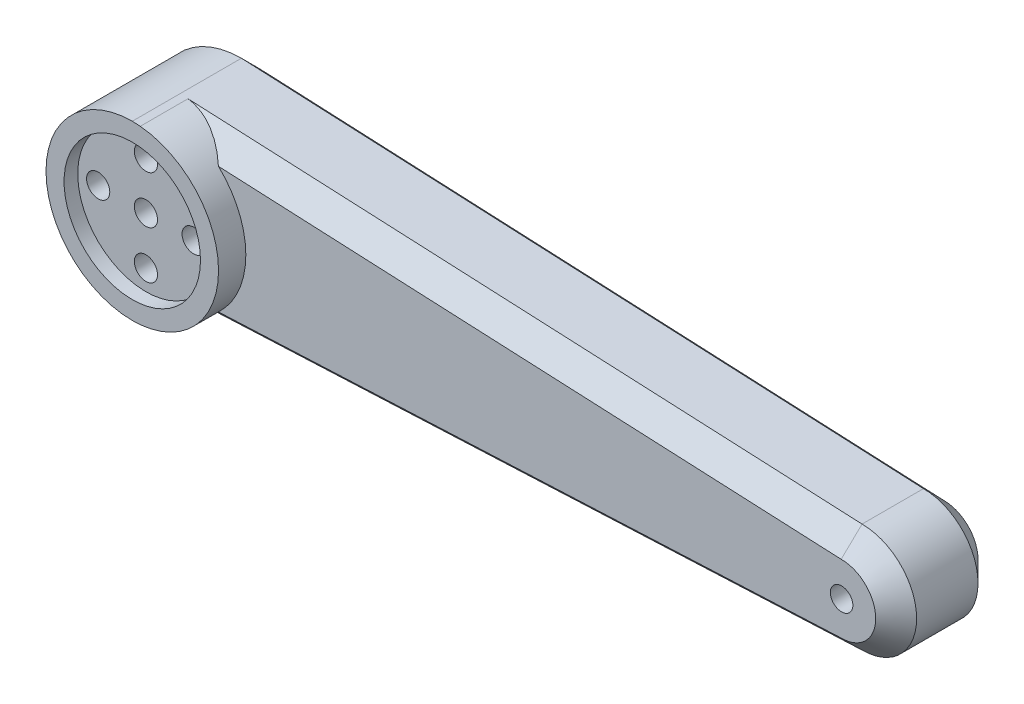
ISO-10303-21;
HEADER;
FILE_DESCRIPTION(('STEP AP214'),'2;1');
FILE_NAME('part.step','',(''),(''),'','','');
FILE_SCHEMA(('AUTOMOTIVE_DESIGN { 1 0 10303 214 1 1 1 1 }'));
ENDSEC;
DATA;
#1=APPLICATION_CONTEXT('core data for automotive mechanical design processes');
#2=APPLICATION_PROTOCOL_DEFINITION('international standard','automotive_design',2000,#1);
#3=PRODUCT_CONTEXT('',#1,'mechanical');
#4=PRODUCT('Part','Part','',(#3));
#5=PRODUCT_RELATED_PRODUCT_CATEGORY('part','',(#4));
#6=PRODUCT_DEFINITION_FORMATION('','',#4);
#7=PRODUCT_DEFINITION_CONTEXT('part definition',#1,'design');
#8=PRODUCT_DEFINITION('design','',#6,#7);
#9=PRODUCT_DEFINITION_SHAPE('','',#8);
#10=(LENGTH_UNIT() NAMED_UNIT(*) SI_UNIT(.MILLI.,.METRE.));
#11=(NAMED_UNIT(*) PLANE_ANGLE_UNIT() SI_UNIT($,.RADIAN.));
#12=(NAMED_UNIT(*) SI_UNIT($,.STERADIAN.) SOLID_ANGLE_UNIT());
#13=UNCERTAINTY_MEASURE_WITH_UNIT(LENGTH_MEASURE(1.E-05),#10,'distance_accuracy_value','');
#14=(GEOMETRIC_REPRESENTATION_CONTEXT(3) GLOBAL_UNCERTAINTY_ASSIGNED_CONTEXT((#13)) GLOBAL_UNIT_ASSIGNED_CONTEXT((#10,
#11,#12)) REPRESENTATION_CONTEXT('',''));
#15=CARTESIAN_POINT('',(0.,0.,0.));
#16=DIRECTION('',(0.,0.,1.));
#17=DIRECTION('',(1.,0.,0.));
#18=AXIS2_PLACEMENT_3D('',#15,#16,#17);
#19=CARTESIAN_POINT('',(100.,0.,17.));
#20=DIRECTION('',(0.,0.,-1.));
#21=DIRECTION('',(-1.,0.,0.));
#22=AXIS2_PLACEMENT_3D('',#19,#20,#21);
#23=CYLINDRICAL_SURFACE('',#22,8.);
#24=DIRECTION('',(0.,0.,-1.));
#25=VECTOR('',#24,1.);
#26=CARTESIAN_POINT('',(100.,8.,17.));
#27=LINE('',#26,#25);
#28=CARTESIAN_POINT('',(100.,8.,12.));
#29=VERTEX_POINT('',#28);
#30=CARTESIAN_POINT('',(100.,8.,3.));
#31=VERTEX_POINT('',#30);
#32=EDGE_CURVE('E229',#29,#31,#27,.T.);
#33=ORIENTED_EDGE('',*,*,#32,.F.);
#34=CARTESIAN_POINT('',(100.,0.,12.));
#35=DIRECTION('',(0.,0.,1.));
#36=DIRECTION('',(1.,0.,0.));
#37=AXIS2_PLACEMENT_3D('',#34,#35,#36);
#38=CIRCLE('',#37,8.);
#39=CARTESIAN_POINT('',(100.,-8.,12.));
#40=VERTEX_POINT('',#39);
#41=EDGE_CURVE('E373',#29,#40,#38,.F.);
#42=ORIENTED_EDGE('',*,*,#41,.T.);
#43=DIRECTION('',(0.,0.,-1.));
#44=VECTOR('',#43,1.);
#45=CARTESIAN_POINT('',(100.,-8.,17.));
#46=LINE('',#45,#44);
#47=CARTESIAN_POINT('',(100.,-8.,3.));
#48=VERTEX_POINT('',#47);
#49=EDGE_CURVE('E231',#40,#48,#46,.T.);
#50=ORIENTED_EDGE('',*,*,#49,.T.);
#51=CARTESIAN_POINT('',(100.,0.,3.));
#52=DIRECTION('',(0.,0.,1.));
#53=DIRECTION('',(1.,0.,0.));
#54=AXIS2_PLACEMENT_3D('',#51,#52,#53);
#55=CIRCLE('',#54,8.);
#56=EDGE_CURVE('E235',#48,#31,#55,.T.);
#57=ORIENTED_EDGE('',*,*,#56,.T.);
#58=EDGE_LOOP('',(#33,#42,#50,#57));
#59=FACE_BOUND('',#58,.T.);
#60=ADVANCED_FACE('F42',(#59),#23,.T.);
#61=CARTESIAN_POINT('',(100.,0.,0.));
#62=DIRECTION('',(0.,0.,1.));
#63=DIRECTION('',(1.,0.,0.));
#64=AXIS2_PLACEMENT_3D('',#61,#62,#63);
#65=CYLINDRICAL_SURFACE('',#64,1.65);
#66=CARTESIAN_POINT('',(100.,0.,0.));
#67=DIRECTION('',(0.,0.,1.));
#68=DIRECTION('',(1.,0.,0.));
#69=AXIS2_PLACEMENT_3D('',#66,#67,#68);
#70=CIRCLE('',#69,1.65);
#71=CARTESIAN_POINT('',(101.65,0.,0.));
#72=VERTEX_POINT('',#71);
#73=EDGE_CURVE('E207',#72,#72,#70,.T.);
#74=ORIENTED_EDGE('',*,*,#73,.F.);
#75=EDGE_LOOP('',(#74));
#76=FACE_BOUND('',#75,.T.);
#77=CARTESIAN_POINT('',(100.,0.,15.));
#78=DIRECTION('',(0.,0.,1.));
#79=DIRECTION('',(1.,0.,0.));
#80=AXIS2_PLACEMENT_3D('',#77,#78,#79);
#81=CIRCLE('',#80,1.65);
#82=CARTESIAN_POINT('',(101.65,0.,15.));
#83=VERTEX_POINT('',#82);
#84=EDGE_CURVE('E173',#83,#83,#81,.F.);
#85=ORIENTED_EDGE('',*,*,#84,.F.);
#86=EDGE_LOOP('',(#85));
#87=FACE_BOUND('',#86,.T.);
#88=ADVANCED_FACE('F407',(#76,#87),#65,.F.);
#89=CARTESIAN_POINT('',(0.,0.,0.));
#90=DIRECTION('',(0.,0.,1.));
#91=DIRECTION('',(1.,0.,0.));
#92=AXIS2_PLACEMENT_3D('',#89,#90,#91);
#93=CYLINDRICAL_SURFACE('',#92,1.7);
#94=CARTESIAN_POINT('',(0.,0.,17.));
#95=DIRECTION('',(0.,0.,1.));
#96=DIRECTION('',(1.,0.,0.));
#97=AXIS2_PLACEMENT_3D('',#94,#95,#96);
#98=CIRCLE('',#97,1.7);
#99=CARTESIAN_POINT('',(1.7,0.,17.));
#100=VERTEX_POINT('',#99);
#101=EDGE_CURVE('E221',#100,#100,#98,.T.);
#102=ORIENTED_EDGE('',*,*,#101,.T.);
#103=EDGE_LOOP('',(#102));
#104=FACE_BOUND('',#103,.T.);
#105=CARTESIAN_POINT('',(0.,0.,2.));
#106=DIRECTION('',(0.,0.,-1.));
#107=DIRECTION('',(-1.,0.,0.));
#108=AXIS2_PLACEMENT_3D('',#105,#106,#107);
#109=CIRCLE('',#108,1.7);
#110=CARTESIAN_POINT('',(-1.7,0.,2.));
#111=VERTEX_POINT('',#110);
#112=EDGE_CURVE('E211',#111,#111,#109,.F.);
#113=ORIENTED_EDGE('',*,*,#112,.F.);
#114=EDGE_LOOP('',(#113));
#115=FACE_BOUND('',#114,.T.);
#116=ADVANCED_FACE('F413',(#104,#115),#93,.F.);
#117=CARTESIAN_POINT('',(0.,-7.,0.));
#118=DIRECTION('',(0.,0.,1.));
#119=DIRECTION('',(1.,0.,0.));
#120=AXIS2_PLACEMENT_3D('',#117,#118,#119);
#121=CYLINDRICAL_SURFACE('',#120,1.7);
#122=CARTESIAN_POINT('',(0.,-7.,17.));
#123=DIRECTION('',(0.,0.,1.));
#124=DIRECTION('',(1.,0.,0.));
#125=AXIS2_PLACEMENT_3D('',#122,#123,#124);
#126=CIRCLE('',#125,1.7);
#127=CARTESIAN_POINT('',(1.69999999999993,-7.,17.));
#128=VERTEX_POINT('',#127);
#129=EDGE_CURVE('E210',#128,#128,#126,.T.);
#130=ORIENTED_EDGE('',*,*,#129,.T.);
#131=EDGE_LOOP('',(#130));
#132=FACE_BOUND('',#131,.T.);
#133=CARTESIAN_POINT('',(0.,-7.,2.));
#134=DIRECTION('',(0.,0.,-1.));
#135=DIRECTION('',(-1.,0.,0.));
#136=AXIS2_PLACEMENT_3D('',#133,#134,#135);
#137=CIRCLE('',#136,1.7);
#138=CARTESIAN_POINT('',(-1.70000000000007,-7.,2.));
#139=VERTEX_POINT('',#138);
#140=EDGE_CURVE('E244',#139,#139,#137,.F.);
#141=ORIENTED_EDGE('',*,*,#140,.F.);
#142=EDGE_LOOP('',(#141));
#143=FACE_BOUND('',#142,.T.);
#144=ADVANCED_FACE('F506',(#132,#143),#121,.F.);
#145=CARTESIAN_POINT('',(7.,0.,0.));
#146=DIRECTION('',(0.,0.,1.));
#147=DIRECTION('',(1.,0.,0.));
#148=AXIS2_PLACEMENT_3D('',#145,#146,#147);
#149=CYLINDRICAL_SURFACE('',#148,1.7);
#150=CARTESIAN_POINT('',(7.,0.,17.));
#151=DIRECTION('',(0.,0.,1.));
#152=DIRECTION('',(1.,0.,0.));
#153=AXIS2_PLACEMENT_3D('',#150,#151,#152);
#154=CIRCLE('',#153,1.7);
#155=CARTESIAN_POINT('',(8.7,0.,17.));
#156=VERTEX_POINT('',#155);
#157=EDGE_CURVE('E212',#156,#156,#154,.T.);
#158=ORIENTED_EDGE('',*,*,#157,.T.);
#159=EDGE_LOOP('',(#158));
#160=FACE_BOUND('',#159,.T.);
#161=CARTESIAN_POINT('',(7.,0.,2.));
#162=DIRECTION('',(0.,0.,-1.));
#163=DIRECTION('',(-1.,0.,0.));
#164=AXIS2_PLACEMENT_3D('',#161,#162,#163);
#165=CIRCLE('',#164,1.7);
#166=CARTESIAN_POINT('',(5.3,0.,2.));
#167=VERTEX_POINT('',#166);
#168=EDGE_CURVE('E241',#167,#167,#165,.F.);
#169=ORIENTED_EDGE('',*,*,#168,.F.);
#170=EDGE_LOOP('',(#169));
#171=FACE_BOUND('',#170,.T.);
#172=ADVANCED_FACE('F499',(#160,#171),#149,.F.);
#173=CARTESIAN_POINT('',(0.,7.,0.));
#174=DIRECTION('',(0.,0.,1.));
#175=DIRECTION('',(1.,0.,0.));
#176=AXIS2_PLACEMENT_3D('',#173,#174,#175);
#177=CYLINDRICAL_SURFACE('',#176,1.7);
#178=CARTESIAN_POINT('',(0.,7.,17.));
#179=DIRECTION('',(0.,0.,1.));
#180=DIRECTION('',(1.,0.,0.));
#181=AXIS2_PLACEMENT_3D('',#178,#179,#180);
#182=CIRCLE('',#181,1.7);
#183=CARTESIAN_POINT('',(1.70000000000002,7.,17.));
#184=VERTEX_POINT('',#183);
#185=EDGE_CURVE('E215',#184,#184,#182,.T.);
#186=ORIENTED_EDGE('',*,*,#185,.T.);
#187=EDGE_LOOP('',(#186));
#188=FACE_BOUND('',#187,.T.);
#189=CARTESIAN_POINT('',(0.,7.,2.));
#190=DIRECTION('',(0.,0.,-1.));
#191=DIRECTION('',(-1.,0.,0.));
#192=AXIS2_PLACEMENT_3D('',#189,#190,#191);
#193=CIRCLE('',#192,1.7);
#194=CARTESIAN_POINT('',(-1.69999999999998,7.,2.));
#195=VERTEX_POINT('',#194);
#196=EDGE_CURVE('E238',#195,#195,#193,.F.);
#197=ORIENTED_EDGE('',*,*,#196,.F.);
#198=EDGE_LOOP('',(#197));
#199=FACE_BOUND('',#198,.T.);
#200=ADVANCED_FACE('F428',(#188,#199),#177,.F.);
#201=CARTESIAN_POINT('',(-7.,0.,0.));
#202=DIRECTION('',(0.,0.,1.));
#203=DIRECTION('',(1.,0.,0.));
#204=AXIS2_PLACEMENT_3D('',#201,#202,#203);
#205=CYLINDRICAL_SURFACE('',#204,1.7);
#206=CARTESIAN_POINT('',(-7.,0.,17.));
#207=DIRECTION('',(0.,0.,1.));
#208=DIRECTION('',(1.,0.,0.));
#209=AXIS2_PLACEMENT_3D('',#206,#207,#208);
#210=CIRCLE('',#209,1.7);
#211=CARTESIAN_POINT('',(-5.3,0.,17.));
#212=VERTEX_POINT('',#211);
#213=EDGE_CURVE('E218',#212,#212,#210,.T.);
#214=ORIENTED_EDGE('',*,*,#213,.T.);
#215=EDGE_LOOP('',(#214));
#216=FACE_BOUND('',#215,.T.);
#217=CARTESIAN_POINT('',(-7.,0.,2.));
#218=DIRECTION('',(0.,0.,-1.));
#219=DIRECTION('',(-1.,0.,0.));
#220=AXIS2_PLACEMENT_3D('',#217,#218,#219);
#221=CIRCLE('',#220,1.7);
#222=CARTESIAN_POINT('',(-8.7,0.,2.));
#223=VERTEX_POINT('',#222);
#224=EDGE_CURVE('E204',#223,#223,#221,.F.);
#225=ORIENTED_EDGE('',*,*,#224,.F.);
#226=EDGE_LOOP('',(#225));
#227=FACE_BOUND('',#226,.T.);
#228=ADVANCED_FACE('F423',(#216,#227),#205,.F.);
#229=CARTESIAN_POINT('',(0.,0.,17.));
#230=DIRECTION('',(0.,0.,-1.));
#231=DIRECTION('',(-1.,0.,0.));
#232=AXIS2_PLACEMENT_3D('',#229,#230,#231);
#233=CYLINDRICAL_SURFACE('',#232,12.65);
#234=DIRECTION('',(0.,0.,-1.));
#235=VECTOR('',#234,1.);
#236=CARTESIAN_POINT('',(0.,12.65,17.));
#237=LINE('',#236,#235);
#238=CARTESIAN_POINT('',(0.,12.65,19.));
#239=VERTEX_POINT('',#238);
#240=CARTESIAN_POINT('',(0.,12.65,3.));
#241=VERTEX_POINT('',#240);
#242=EDGE_CURVE('E226',#239,#241,#237,.T.);
#243=ORIENTED_EDGE('',*,*,#242,.T.);
#244=CARTESIAN_POINT('',(0.,0.,3.));
#245=DIRECTION('',(0.,0.,1.));
#246=DIRECTION('',(1.,0.,0.));
#247=AXIS2_PLACEMENT_3D('',#244,#245,#246);
#248=CIRCLE('',#247,12.65);
#249=CARTESIAN_POINT('',(0.,-12.65,3.));
#250=VERTEX_POINT('',#249);
#251=EDGE_CURVE('E432',#241,#250,#248,.T.);
#252=ORIENTED_EDGE('',*,*,#251,.T.);
#253=DIRECTION('',(0.,0.,-1.));
#254=VECTOR('',#253,1.);
#255=CARTESIAN_POINT('',(0.,-12.65,17.));
#256=LINE('',#255,#254);
#257=CARTESIAN_POINT('',(0.,-12.65,19.));
#258=VERTEX_POINT('',#257);
#259=EDGE_CURVE('E233',#258,#250,#256,.T.);
#260=ORIENTED_EDGE('',*,*,#259,.F.);
#261=CARTESIAN_POINT('',(0.,0.,19.));
#262=DIRECTION('',(0.,0.,1.));
#263=DIRECTION('',(1.,0.,0.));
#264=AXIS2_PLACEMENT_3D('',#261,#262,#263);
#265=CIRCLE('',#264,12.65);
#266=EDGE_CURVE('E161',#239,#258,#265,.T.);
#267=ORIENTED_EDGE('',*,*,#266,.F.);
#268=EDGE_LOOP('',(#243,#252,#260,#267));
#269=FACE_BOUND('',#268,.T.);
#270=ADVANCED_FACE('F421',(#269),#233,.T.);
#271=CARTESIAN_POINT('',(0.,-12.65,17.));
#272=DIRECTION('',(-0.0464498090668585,0.998920625093732,0.));
#273=DIRECTION('',(-0.998920625093732,-0.0464498090668585,0.));
#274=AXIS2_PLACEMENT_3D('',#271,#272,#273);
#275=PLANE('',#274);
#276=ORIENTED_EDGE('',*,*,#49,.F.);
#277=DIRECTION('',(-0.998920625093732,-0.0464498090668585,0.));
#278=VECTOR('',#277,1.);
#279=CARTESIAN_POINT('',(1.17391170940634,-12.5954131055126,12.));
#280=LINE('',#279,#278);
#281=CARTESIAN_POINT('',(1.17391170940634,-12.5954131055126,12.));
#282=VERTEX_POINT('',#281);
#283=EDGE_CURVE('E146',#40,#282,#280,.T.);
#284=ORIENTED_EDGE('',*,*,#283,.T.);
#285=DIRECTION('',(0.,0.,1.));
#286=VECTOR('',#285,1.);
#287=CARTESIAN_POINT('',(1.17391170940634,-12.5954131055126,15.));
#288=LINE('',#287,#286);
#289=CARTESIAN_POINT('',(1.17391170940637,-12.5954131055126,19.));
#290=VERTEX_POINT('',#289);
#291=EDGE_CURVE('E138',#282,#290,#288,.T.);
#292=ORIENTED_EDGE('',*,*,#291,.T.);
#293=DIRECTION('',(0.998920625093732,0.0464498090668585,0.));
#294=VECTOR('',#293,1.);
#295=CARTESIAN_POINT('',(0.586955854703168,-12.6227065527563,19.));
#296=LINE('',#295,#294);
#297=EDGE_CURVE('E144',#258,#290,#296,.T.);
#298=ORIENTED_EDGE('',*,*,#297,.F.);
#299=ORIENTED_EDGE('',*,*,#259,.T.);
#300=DIRECTION('',(0.998920625093732,0.0464498090668585,0.));
#301=VECTOR('',#300,1.);
#302=CARTESIAN_POINT('',(0.,-12.65,3.));
#303=LINE('',#302,#301);
#304=EDGE_CURVE('E262',#250,#48,#303,.T.);
#305=ORIENTED_EDGE('',*,*,#304,.T.);
#306=EDGE_LOOP('',(#276,#284,#292,#298,#299,#305));
#307=FACE_BOUND('',#306,.T.);
#308=ADVANCED_FACE('F141',(#307),#275,.F.);
#309=CARTESIAN_POINT('',(0.,12.65,17.));
#310=DIRECTION('',(-0.0464498090668585,-0.998920625093732,0.));
#311=DIRECTION('',(0.998920625093732,-0.0464498090668585,0.));
#312=AXIS2_PLACEMENT_3D('',#309,#310,#311);
#313=PLANE('',#312);
#314=DIRECTION('',(0.,0.,1.));
#315=VECTOR('',#314,1.);
#316=CARTESIAN_POINT('',(1.17391170940634,12.5954131055126,15.));
#317=LINE('',#316,#315);
#318=CARTESIAN_POINT('',(1.17391170940634,12.5954131055126,12.));
#319=VERTEX_POINT('',#318);
#320=CARTESIAN_POINT('',(1.17391170940637,12.5954131055126,19.));
#321=VERTEX_POINT('',#320);
#322=EDGE_CURVE('E59',#319,#321,#317,.T.);
#323=ORIENTED_EDGE('',*,*,#322,.F.);
#324=DIRECTION('',(0.998920625093732,-0.0464498090668585,0.));
#325=VECTOR('',#324,1.);
#326=CARTESIAN_POINT('',(100.,8.,12.));
#327=LINE('',#326,#325);
#328=EDGE_CURVE('E64',#319,#29,#327,.T.);
#329=ORIENTED_EDGE('',*,*,#328,.T.);
#330=ORIENTED_EDGE('',*,*,#32,.T.);
#331=DIRECTION('',(-0.998920625093732,0.0464498090668585,0.));
#332=VECTOR('',#331,1.);
#333=CARTESIAN_POINT('',(0.,12.65,3.));
#334=LINE('',#333,#332);
#335=EDGE_CURVE('E316',#31,#241,#334,.T.);
#336=ORIENTED_EDGE('',*,*,#335,.T.);
#337=ORIENTED_EDGE('',*,*,#242,.F.);
#338=DIRECTION('',(-0.998920625093732,0.0464498090668585,0.));
#339=VECTOR('',#338,1.);
#340=CARTESIAN_POINT('',(0.586955854703168,12.6227065527563,19.));
#341=LINE('',#340,#339);
#342=EDGE_CURVE('E156',#321,#239,#341,.T.);
#343=ORIENTED_EDGE('',*,*,#342,.F.);
#344=EDGE_LOOP('',(#323,#329,#330,#336,#337,#343));
#345=FACE_BOUND('',#344,.T.);
#346=ADVANCED_FACE('F418',(#345),#313,.F.);
#347=CARTESIAN_POINT('',(0.,0.,17.));
#348=DIRECTION('',(0.,0.,1.));
#349=DIRECTION('',(1.,0.,0.));
#350=AXIS2_PLACEMENT_3D('',#347,#348,#349);
#351=PLANE('',#350);
#352=CARTESIAN_POINT('',(0.,0.,17.));
#353=DIRECTION('',(0.,0.,1.));
#354=DIRECTION('',(1.,0.,0.));
#355=AXIS2_PLACEMENT_3D('',#352,#353,#354);
#356=CIRCLE('',#355,10.);
#357=CARTESIAN_POINT('',(10.,0.,17.));
#358=VERTEX_POINT('',#357);
#359=EDGE_CURVE('E12',#358,#358,#356,.F.);
#360=ORIENTED_EDGE('',*,*,#359,.F.);
#361=EDGE_LOOP('',(#360));
#362=FACE_BOUND('',#361,.T.);
#363=ORIENTED_EDGE('',*,*,#101,.F.);
#364=EDGE_LOOP('',(#363));
#365=FACE_BOUND('',#364,.T.);
#366=ORIENTED_EDGE('',*,*,#129,.F.);
#367=EDGE_LOOP('',(#366));
#368=FACE_BOUND('',#367,.T.);
#369=ORIENTED_EDGE('',*,*,#157,.F.);
#370=EDGE_LOOP('',(#369));
#371=FACE_BOUND('',#370,.T.);
#372=ORIENTED_EDGE('',*,*,#185,.F.);
#373=EDGE_LOOP('',(#372));
#374=FACE_BOUND('',#373,.T.);
#375=ORIENTED_EDGE('',*,*,#213,.F.);
#376=EDGE_LOOP('',(#375));
#377=FACE_BOUND('',#376,.T.);
#378=ADVANCED_FACE('F480',(#362,#365,#368,#371,#374,#377),#351,.T.);
#379=CARTESIAN_POINT('',(0.,0.,0.));
#380=DIRECTION('',(0.,0.,1.));
#381=DIRECTION('',(1.,0.,0.));
#382=AXIS2_PLACEMENT_3D('',#379,#380,#381);
#383=PLANE('',#382);
#384=CARTESIAN_POINT('',(7.,0.,0.));
#385=DIRECTION('',(0.,0.,-1.));
#386=DIRECTION('',(-1.,0.,0.));
#387=AXIS2_PLACEMENT_3D('',#384,#385,#386);
#388=CIRCLE('',#387,3.);
#389=CARTESIAN_POINT('',(4.,0.,0.));
#390=VERTEX_POINT('',#389);
#391=EDGE_CURVE('E193',#390,#390,#388,.T.);
#392=ORIENTED_EDGE('',*,*,#391,.F.);
#393=EDGE_LOOP('',(#392));
#394=FACE_BOUND('',#393,.T.);
#395=CARTESIAN_POINT('',(0.,-6.99999999999998,0.));
#396=DIRECTION('',(0.,0.,-1.));
#397=DIRECTION('',(-1.,0.,0.));
#398=AXIS2_PLACEMENT_3D('',#395,#396,#397);
#399=CIRCLE('',#398,2.99999999999998);
#400=CARTESIAN_POINT('',(-1.64504511716238,-9.50875,0.));
#401=VERTEX_POINT('',#400);
#402=CARTESIAN_POINT('',(1.53894727721576,-9.57519732796343,0.));
#403=VERTEX_POINT('',#402);
#404=EDGE_CURVE('E185',#401,#403,#399,.T.);
#405=ORIENTED_EDGE('',*,*,#404,.F.);
#406=CARTESIAN_POINT('',(0.,0.,0.));
#407=DIRECTION('',(0.,0.,1.));
#408=DIRECTION('',(1.,0.,0.));
#409=AXIS2_PLACEMENT_3D('',#406,#407,#408);
#410=CIRCLE('',#409,9.64999999999999);
#411=CARTESIAN_POINT('',(-9.50875000000004,-1.64504511716214,0.));
#412=VERTEX_POINT('',#411);
#413=EDGE_CURVE('E260',#401,#412,#410,.F.);
#414=ORIENTED_EDGE('',*,*,#413,.T.);
#415=CARTESIAN_POINT('',(-6.99999999999993,0.,0.));
#416=DIRECTION('',(0.,0.,-1.));
#417=DIRECTION('',(-1.,0.,0.));
#418=AXIS2_PLACEMENT_3D('',#415,#416,#417);
#419=CIRCLE('',#418,2.99999999999994);
#420=CARTESIAN_POINT('',(-9.50875000000003,1.64504511716221,0.));
#421=VERTEX_POINT('',#420);
#422=EDGE_CURVE('E179',#421,#412,#419,.T.);
#423=ORIENTED_EDGE('',*,*,#422,.F.);
#424=CARTESIAN_POINT('',(0.,0.,0.));
#425=DIRECTION('',(0.,0.,1.));
#426=DIRECTION('',(1.,0.,0.));
#427=AXIS2_PLACEMENT_3D('',#424,#425,#426);
#428=CIRCLE('',#427,9.64999999999999);
#429=CARTESIAN_POINT('',(-1.6450451171622,9.50875000000003,0.));
#430=VERTEX_POINT('',#429);
#431=EDGE_CURVE('E258',#421,#430,#428,.F.);
#432=ORIENTED_EDGE('',*,*,#431,.T.);
#433=CARTESIAN_POINT('',(0.,6.99999999999995,0.));
#434=DIRECTION('',(0.,0.,-1.));
#435=DIRECTION('',(-1.,0.,0.));
#436=AXIS2_PLACEMENT_3D('',#433,#434,#435);
#437=CIRCLE('',#436,2.99999999999997);
#438=CARTESIAN_POINT('',(1.53894727721576,9.57519732796343,0.));
#439=VERTEX_POINT('',#438);
#440=EDGE_CURVE('E178',#439,#430,#437,.T.);
#441=ORIENTED_EDGE('',*,*,#440,.F.);
#442=DIRECTION('',(0.998920625093732,-0.0464498090668585,0.));
#443=VECTOR('',#442,1.);
#444=CARTESIAN_POINT('',(0.447606427502592,9.62594467747509,0.));
#445=LINE('',#444,#443);
#446=CARTESIAN_POINT('',(99.9384381989796,4.99962100010141,0.));
#447=VERTEX_POINT('',#446);
#448=EDGE_CURVE('E251',#439,#447,#445,.T.);
#449=ORIENTED_EDGE('',*,*,#448,.T.);
#450=CARTESIAN_POINT('',(100.,0.,0.));
#451=DIRECTION('',(0.,0.,1.));
#452=DIRECTION('',(1.,0.,0.));
#453=AXIS2_PLACEMENT_3D('',#450,#451,#452);
#454=CIRCLE('',#453,4.99999999999999);
#455=CARTESIAN_POINT('',(99.9384381989796,-4.99962100010141,0.));
#456=VERTEX_POINT('',#455);
#457=EDGE_CURVE('E253',#447,#456,#454,.F.);
#458=ORIENTED_EDGE('',*,*,#457,.T.);
#459=DIRECTION('',(-0.998920625093732,-0.0464498090668585,0.));
#460=VECTOR('',#459,1.);
#461=CARTESIAN_POINT('',(0.447606427502592,-9.62594467747509,0.));
#462=LINE('',#461,#460);
#463=EDGE_CURVE('E256',#456,#403,#462,.T.);
#464=ORIENTED_EDGE('',*,*,#463,.T.);
#465=EDGE_LOOP('',(#405,#414,#423,#432,#441,#449,#458,#464));
#466=FACE_BOUND('',#465,.T.);
#467=CARTESIAN_POINT('',(0.,0.,0.));
#468=DIRECTION('',(0.,0.,-1.));
#469=DIRECTION('',(-1.,0.,0.));
#470=AXIS2_PLACEMENT_3D('',#467,#468,#469);
#471=CIRCLE('',#470,3.);
#472=CARTESIAN_POINT('',(-3.,0.,0.));
#473=VERTEX_POINT('',#472);
#474=EDGE_CURVE('E192',#473,#473,#471,.T.);
#475=ORIENTED_EDGE('',*,*,#474,.F.);
#476=EDGE_LOOP('',(#475));
#477=FACE_BOUND('',#476,.T.);
#478=ORIENTED_EDGE('',*,*,#73,.T.);
#479=EDGE_LOOP('',(#478));
#480=FACE_BOUND('',#479,.T.);
#481=ADVANCED_FACE('F461',(#394,#466,#477,#480),#383,.F.);
#482=CARTESIAN_POINT('',(-6.99999999999993,0.,2.));
#483=DIRECTION('',(0.,0.,-1.));
#484=DIRECTION('',(-1.,0.,0.));
#485=AXIS2_PLACEMENT_3D('',#482,#483,#484);
#486=PLANE('',#485);
#487=CARTESIAN_POINT('',(-6.99999999999993,0.,2.));
#488=DIRECTION('',(0.,0.,-1.));
#489=DIRECTION('',(-1.,0.,0.));
#490=AXIS2_PLACEMENT_3D('',#487,#488,#489);
#491=CIRCLE('',#490,2.99999999999994);
#492=CARTESIAN_POINT('',(-9.99999999999987,0.,2.));
#493=VERTEX_POINT('',#492);
#494=EDGE_CURVE('E175',#493,#493,#491,.T.);
#495=ORIENTED_EDGE('',*,*,#494,.T.);
#496=EDGE_LOOP('',(#495));
#497=FACE_BOUND('',#496,.T.);
#498=ORIENTED_EDGE('',*,*,#224,.T.);
#499=EDGE_LOOP('',(#498));
#500=FACE_BOUND('',#499,.T.);
#501=ADVANCED_FACE('F457',(#497,#500),#486,.T.);
#502=CARTESIAN_POINT('',(-6.99999999999993,0.,2.));
#503=DIRECTION('',(0.,0.,-1.));
#504=DIRECTION('',(-1.,0.,0.));
#505=AXIS2_PLACEMENT_3D('',#502,#503,#504);
#506=CYLINDRICAL_SURFACE('',#505,2.99999999999994);
#507=ORIENTED_EDGE('',*,*,#494,.F.);
#508=EDGE_LOOP('',(#507));
#509=FACE_BOUND('',#508,.T.);
#510=ORIENTED_EDGE('',*,*,#422,.T.);
#511=CARTESIAN_POINT('',(-9.50875000000004,-1.64504511716214,0.));
#512=CARTESIAN_POINT('',(-9.54661353625065,-1.58731378132999,0.0274655591793818));
#513=CARTESIAN_POINT('',(-9.58277628074685,-1.52780557981531,0.0535805141607215));
#514=CARTESIAN_POINT('',(-9.65133638210864,-1.40546301077051,0.102913377530382));
#515=CARTESIAN_POINT('',(-9.68373159620295,-1.34262677971398,0.12612963784199));
#516=CARTESIAN_POINT('',(-9.74443512408144,-1.21373901683368,0.16949916489995));
#517=CARTESIAN_POINT('',(-9.77273157756221,-1.14767886557504,0.189643551311587));
#518=CARTESIAN_POINT('',(-9.82475412160689,-1.01291222109178,0.226583257516783));
#519=CARTESIAN_POINT('',(-9.84848105772054,-0.94420622028765,0.243379196931822));
#520=CARTESIAN_POINT('',(-9.91245094805878,-0.734182897327812,0.288573375910779));
#521=CARTESIAN_POINT('',(-9.94531095401736,-0.589321162270465,0.311655705020828));
#522=CARTESIAN_POINT('',(-9.98915587450147,-0.295044986032343,0.342418343642189));
#523=CARTESIAN_POINT('',(-10.000182682888,-0.145639823547161,0.350128150375599));
#524=CARTESIAN_POINT('',(-9.99982338549021,0.14445578859272,0.349876113263188));
#525=CARTESIAN_POINT('',(-9.9896984110141,0.285149794287533,0.342796084223358));
#526=CARTESIAN_POINT('',(-9.95012059599628,0.562523599007837,0.315032760373903));
#527=CARTESIAN_POINT('',(-9.92065016437547,0.699199626140535,0.294337084639134));
#528=CARTESIAN_POINT('',(-9.8441766779897,0.96416193013686,0.24035856858696));
#529=CARTESIAN_POINT('',(-9.79725412528316,1.09248359839772,0.207133513375369));
#530=CARTESIAN_POINT('',(-9.68818879943053,1.33854828206915,0.129373352977907));
#531=CARTESIAN_POINT('',(-9.62607019086236,1.45630769107284,0.084856200236832));
#532=CARTESIAN_POINT('',(-9.54171620908156,1.59393342205345,0.0238906430183101));
#533=CARTESIAN_POINT('',(-9.52539518457176,1.61966526739388,0.0120742186846198));
#534=CARTESIAN_POINT('',(-9.50875000000003,1.64504511716221,0.));
#535=B_SPLINE_CURVE_WITH_KNOTS('',3,(#511,#512,#513,#514,#515,#516,#517,#518,#519,#520,#521,
#522,#523,#524,#525,#526,#527,#528,#529,#530,#531,#532,#533,#534),.UNSPECIFIED.,.F.,.F.,(4,2,2,
2,2,2,2,2,2,2,2,4),(0.,0.222876422196433,0.445878991096783,0.669514481043631,0.893108549329248,
1.34153472579726,1.78909961843022,2.21074224610466,2.63276881107062,3.0528723454925,
3.47231213021166,3.57033634246214),.UNSPECIFIED.);
#536=EDGE_CURVE('E441',#412,#421,#535,.T.);
#537=ORIENTED_EDGE('',*,*,#536,.T.);
#538=EDGE_LOOP('',(#510,#537));
#539=FACE_BOUND('',#538,.T.);
#540=ADVANCED_FACE('F301',(#509,#539),#506,.F.);
#541=CARTESIAN_POINT('',(0.,6.99999999999995,2.));
#542=DIRECTION('',(0.,0.,-1.));
#543=DIRECTION('',(-1.,0.,0.));
#544=AXIS2_PLACEMENT_3D('',#541,#542,#543);
#545=PLANE('',#544);
#546=CARTESIAN_POINT('',(0.,6.99999999999995,2.));
#547=DIRECTION('',(0.,0.,-1.));
#548=DIRECTION('',(-1.,0.,0.));
#549=AXIS2_PLACEMENT_3D('',#546,#547,#548);
#550=CIRCLE('',#549,2.99999999999997);
#551=CARTESIAN_POINT('',(-2.9999999999999,6.99999999999995,2.));
#552=VERTEX_POINT('',#551);
#553=EDGE_CURVE('E196',#552,#552,#550,.T.);
#554=ORIENTED_EDGE('',*,*,#553,.T.);
#555=EDGE_LOOP('',(#554));
#556=FACE_BOUND('',#555,.T.);
#557=ORIENTED_EDGE('',*,*,#196,.T.);
#558=EDGE_LOOP('',(#557));
#559=FACE_BOUND('',#558,.T.);
#560=ADVANCED_FACE('F298',(#556,#559),#545,.T.);
#561=CARTESIAN_POINT('',(0.,6.99999999999995,2.));
#562=DIRECTION('',(0.,0.,-1.));
#563=DIRECTION('',(-1.,0.,0.));
#564=AXIS2_PLACEMENT_3D('',#561,#562,#563);
#565=CYLINDRICAL_SURFACE('',#564,2.99999999999997);
#566=ORIENTED_EDGE('',*,*,#553,.F.);
#567=EDGE_LOOP('',(#566));
#568=FACE_BOUND('',#567,.T.);
#569=ORIENTED_EDGE('',*,*,#440,.T.);
#570=CARTESIAN_POINT('',(-1.6450451171622,9.50875000000003,0.));
#571=CARTESIAN_POINT('',(-1.58672576147228,9.54698681221508,0.0277364626649051));
#572=CARTESIAN_POINT('',(-1.52664262724166,9.58347734321223,0.0540868558791562));
#573=CARTESIAN_POINT('',(-1.40308815240806,9.65261638960969,0.10383247058643));
#574=CARTESIAN_POINT('',(-1.33961488639291,9.6852626872284,0.127225986789388));
#575=CARTESIAN_POINT('',(-1.14810991679089,9.77511726588336,0.191414938851925));
#576=CARTESIAN_POINT('',(-1.01566144720115,9.82644452941194,0.227808858387094));
#577=CARTESIAN_POINT('',(-0.814297618950278,9.88817147640425,0.271420920852166));
#578=CARTESIAN_POINT('',(-0.748625223758739,9.90589527371255,0.283914266198306));
#579=CARTESIAN_POINT('',(-0.61570934140119,9.93692863211882,0.305758163560732));
#580=CARTESIAN_POINT('',(-0.548465872767904,9.95023824525936,0.315108752629654));
#581=CARTESIAN_POINT('',(-0.411067317933195,9.97253975495636,0.330762604325969));
#582=CARTESIAN_POINT('',(-0.340882268706382,9.98140809325327,0.33697869299148));
#583=CARTESIAN_POINT('',(-0.19981673472218,9.99417929227154,0.34592516974071));
#584=CARTESIAN_POINT('',(-0.12893600755024,9.99808035537512,0.348654295921393));
#585=CARTESIAN_POINT('',(-0.0579741860694406,9.99943977998377,0.349607838299091));
#586=B_SPLINE_CURVE_WITH_KNOTS('',3,(#570,#571,#572,#573,#574,#575,#576,#577,#578,#579,#580,
#581,#582,#583,#584,#585),.UNSPECIFIED.,.F.,.F.,(4,2,2,2,2,2,2,4),(0.,0.22502329572968,
0.450175780433674,0.887721746789029,1.0950258274397,1.30232746391981,1.5151140126703,
1.72797754533138),.UNSPECIFIED.);
#587=CARTESIAN_POINT('',(-0.0579741860694562,9.99943977998377,0.34960783829909));
#588=VERTEX_POINT('',#587);
#589=EDGE_CURVE('E309',#430,#588,#586,.T.);
#590=ORIENTED_EDGE('',*,*,#589,.T.);
#591=CARTESIAN_POINT('',(0.,6.99999999999995,-2.64390153177961));
#592=DIRECTION('',(-0.032844974975996,-0.706343547870882,0.707106781186549));
#593=DIRECTION('',(-0.0328449749759961,-0.706343547870884,-0.707106781186546));
#594=AXIS2_PLACEMENT_3D('',#591,#592,#593);
#595=ELLIPSE('',#594,4.24264068711923,2.99999999999997);
#596=EDGE_CURVE('E317',#588,#439,#595,.F.);
#597=ORIENTED_EDGE('',*,*,#596,.T.);
#598=EDGE_LOOP('',(#569,#590,#597));
#599=FACE_BOUND('',#598,.T.);
#600=ADVANCED_FACE('F293',(#568,#599),#565,.F.);
#601=CARTESIAN_POINT('',(7.,0.,2.));
#602=DIRECTION('',(0.,0.,-1.));
#603=DIRECTION('',(-1.,0.,0.));
#604=AXIS2_PLACEMENT_3D('',#601,#602,#603);
#605=PLANE('',#604);
#606=CARTESIAN_POINT('',(7.,0.,2.));
#607=DIRECTION('',(0.,0.,-1.));
#608=DIRECTION('',(-1.,0.,0.));
#609=AXIS2_PLACEMENT_3D('',#606,#607,#608);
#610=CIRCLE('',#609,3.);
#611=CARTESIAN_POINT('',(4.,0.,2.));
#612=VERTEX_POINT('',#611);
#613=EDGE_CURVE('E189',#612,#612,#610,.T.);
#614=ORIENTED_EDGE('',*,*,#613,.T.);
#615=EDGE_LOOP('',(#614));
#616=FACE_BOUND('',#615,.T.);
#617=ORIENTED_EDGE('',*,*,#168,.T.);
#618=EDGE_LOOP('',(#617));
#619=FACE_BOUND('',#618,.T.);
#620=ADVANCED_FACE('F289',(#616,#619),#605,.T.);
#621=CARTESIAN_POINT('',(7.,0.,2.));
#622=DIRECTION('',(0.,0.,-1.));
#623=DIRECTION('',(-1.,0.,0.));
#624=AXIS2_PLACEMENT_3D('',#621,#622,#623);
#625=CYLINDRICAL_SURFACE('',#624,3.);
#626=ORIENTED_EDGE('',*,*,#613,.F.);
#627=EDGE_LOOP('',(#626));
#628=FACE_BOUND('',#627,.T.);
#629=ORIENTED_EDGE('',*,*,#391,.T.);
#630=EDGE_LOOP('',(#629));
#631=FACE_BOUND('',#630,.T.);
#632=ADVANCED_FACE('F292',(#628,#631),#625,.F.);
#633=CARTESIAN_POINT('',(0.,-6.99999999999998,2.));
#634=DIRECTION('',(0.,0.,-1.));
#635=DIRECTION('',(-1.,0.,0.));
#636=AXIS2_PLACEMENT_3D('',#633,#634,#635);
#637=PLANE('',#636);
#638=CARTESIAN_POINT('',(0.,-6.99999999999998,2.));
#639=DIRECTION('',(0.,0.,-1.));
#640=DIRECTION('',(-1.,0.,0.));
#641=AXIS2_PLACEMENT_3D('',#638,#639,#640);
#642=CIRCLE('',#641,2.99999999999998);
#643=CARTESIAN_POINT('',(-2.99999999999998,-6.99999999999998,2.));
#644=VERTEX_POINT('',#643);
#645=EDGE_CURVE('E182',#644,#644,#642,.T.);
#646=ORIENTED_EDGE('',*,*,#645,.T.);
#647=EDGE_LOOP('',(#646));
#648=FACE_BOUND('',#647,.T.);
#649=ORIENTED_EDGE('',*,*,#140,.T.);
#650=EDGE_LOOP('',(#649));
#651=FACE_BOUND('',#650,.T.);
#652=ADVANCED_FACE('F286',(#648,#651),#637,.T.);
#653=CARTESIAN_POINT('',(0.,-6.99999999999998,2.));
#654=DIRECTION('',(0.,0.,-1.));
#655=DIRECTION('',(-1.,0.,0.));
#656=AXIS2_PLACEMENT_3D('',#653,#654,#655);
#657=CYLINDRICAL_SURFACE('',#656,2.99999999999998);
#658=ORIENTED_EDGE('',*,*,#645,.F.);
#659=EDGE_LOOP('',(#658));
#660=FACE_BOUND('',#659,.T.);
#661=ORIENTED_EDGE('',*,*,#404,.T.);
#662=CARTESIAN_POINT('',(0.,-6.99999999999998,-2.64390153177959));
#663=DIRECTION('',(-0.032844974975996,0.706343547870882,0.707106781186549));
#664=DIRECTION('',(-0.0328449749759961,0.706343547870884,-0.707106781186546));
#665=AXIS2_PLACEMENT_3D('',#662,#663,#664);
#666=ELLIPSE('',#665,4.24264068711926,2.99999999999998);
#667=CARTESIAN_POINT('',(-0.0579741860694561,-9.99943977998381,0.349607838299124));
#668=VERTEX_POINT('',#667);
#669=EDGE_CURVE('E273',#403,#668,#666,.F.);
#670=ORIENTED_EDGE('',*,*,#669,.T.);
#671=CARTESIAN_POINT('',(-0.0579741860694561,-9.99943977998381,0.349607838299124));
#672=CARTESIAN_POINT('',(-0.132813296071656,-9.99800848663335,0.348603536680789));
#673=CARTESIAN_POINT('',(-0.207561446431366,-9.99374697052308,0.345622505869509));
#674=CARTESIAN_POINT('',(-0.356252028325136,-9.97970382321191,0.335784406921824));
#675=CARTESIAN_POINT('',(-0.430194761031816,-9.96992433302859,0.328928842133558));
#676=CARTESIAN_POINT('',(-0.574730930726142,-9.94532106868379,0.311654687290488));
#677=CARTESIAN_POINT('',(-0.645360887541322,-9.93064067914672,0.301337338769588));
#678=CARTESIAN_POINT('',(-0.784801128849185,-9.8964200384211,0.27723655604506));
#679=CARTESIAN_POINT('',(-0.853611489140467,-9.8768799900244,0.263453266473669));
#680=CARTESIAN_POINT('',(-1.05023221218178,-9.8134155163691,0.218570768548174));
#681=CARTESIAN_POINT('',(-1.1751813641775,-9.76341008139998,0.183077744060143));
#682=CARTESIAN_POINT('',(-1.35605991953942,-9.67689408341248,0.121230930329746));
#683=CARTESIAN_POINT('',(-1.41600689154972,-9.64564516071173,0.0988253302526389));
#684=CARTESIAN_POINT('',(-1.53284620659664,-9.5797031928983,0.0513611444144118));
#685=CARTESIAN_POINT('',(-1.58973981445967,-9.54501159111659,0.0263036701517524));
#686=CARTESIAN_POINT('',(-1.64504511716239,-9.50875,0.));
#687=B_SPLINE_CURVE_WITH_KNOTS('',3,(#671,#672,#673,#674,#675,#676,#677,#678,#679,#680,#681,
#682,#683,#684,#685,#686),.UNSPECIFIED.,.F.,.F.,(4,2,2,2,2,2,2,4),(0.,0.224484385667396,
0.448881729455217,0.667217940561821,0.885545042103253,1.30112056483407,1.51461913483523,
1.72802857146078),.UNSPECIFIED.);
#688=EDGE_CURVE('E265',#668,#401,#687,.T.);
#689=ORIENTED_EDGE('',*,*,#688,.T.);
#690=EDGE_LOOP('',(#661,#670,#689));
#691=FACE_BOUND('',#690,.T.);
#692=ADVANCED_FACE('F280',(#660,#691),#657,.F.);
#693=CARTESIAN_POINT('',(0.,0.,2.));
#694=DIRECTION('',(0.,0.,-1.));
#695=DIRECTION('',(-1.,0.,0.));
#696=AXIS2_PLACEMENT_3D('',#693,#694,#695);
#697=PLANE('',#696);
#698=CARTESIAN_POINT('',(0.,0.,2.));
#699=DIRECTION('',(0.,0.,-1.));
#700=DIRECTION('',(-1.,0.,0.));
#701=AXIS2_PLACEMENT_3D('',#698,#699,#700);
#702=CIRCLE('',#701,3.);
#703=CARTESIAN_POINT('',(-3.,0.,2.));
#704=VERTEX_POINT('',#703);
#705=EDGE_CURVE('E201',#704,#704,#702,.T.);
#706=ORIENTED_EDGE('',*,*,#705,.T.);
#707=EDGE_LOOP('',(#706));
#708=FACE_BOUND('',#707,.T.);
#709=ORIENTED_EDGE('',*,*,#112,.T.);
#710=EDGE_LOOP('',(#709));
#711=FACE_BOUND('',#710,.T.);
#712=ADVANCED_FACE('F285',(#708,#711),#697,.T.);
#713=CARTESIAN_POINT('',(0.,0.,2.));
#714=DIRECTION('',(0.,0.,-1.));
#715=DIRECTION('',(-1.,0.,0.));
#716=AXIS2_PLACEMENT_3D('',#713,#714,#715);
#717=CYLINDRICAL_SURFACE('',#716,3.);
#718=ORIENTED_EDGE('',*,*,#705,.F.);
#719=EDGE_LOOP('',(#718));
#720=FACE_BOUND('',#719,.T.);
#721=ORIENTED_EDGE('',*,*,#474,.T.);
#722=EDGE_LOOP('',(#721));
#723=FACE_BOUND('',#722,.T.);
#724=ADVANCED_FACE('F528',(#720,#723),#717,.F.);
#725=CARTESIAN_POINT('',(0.,0.,3.));
#726=DIRECTION('',(0.,0.,1.));
#727=DIRECTION('',(1.,0.,0.));
#728=AXIS2_PLACEMENT_3D('',#725,#726,#727);
#729=CONICAL_SURFACE('',#728,12.65,0.78539816339745);
#730=ORIENTED_EDGE('',*,*,#413,.F.);
#731=ORIENTED_EDGE('',*,*,#688,.F.);
#732=CARTESIAN_POINT('',(0.,-12.65,3.));
#733=CARTESIAN_POINT('',(-0.0213919237238861,-11.7204271460858,2.07043685292528));
#734=CARTESIAN_POINT('',(-0.0419701918347069,-10.7908217711566,1.14087901408588));
#735=CARTESIAN_POINT('',(-0.0795769649109478,-8.93152295257525,-0.718159751436445));
#736=CARTESIAN_POINT('',(-0.0966055832656863,-8.0018295126856,-1.6476406796278));
#737=CARTESIAN_POINT('',(-0.118046035393791,-6.60713048992913,-3.04183020416497));
#738=CARTESIAN_POINT('',(-0.124509253938984,-6.14218883645876,-3.50657022654909));
#739=CARTESIAN_POINT('',(-0.135478019692643,-5.21225198345736,-4.43601282612189));
#740=CARTESIAN_POINT('',(-0.139983582748021,-4.74725678439026,-4.90071540358324));
#741=CARTESIAN_POINT('',(-0.146082940845784,-3.81716670174025,-5.83008488435654));
#742=CARTESIAN_POINT('',(-0.147676608050508,-3.35207181467729,-6.29475178520675));
#743=CARTESIAN_POINT('',(-0.146195162094976,-2.65433478178747,-6.99166688537032));
#744=CARTESIAN_POINT('',(-0.145055980094764,-2.42173679304499,-7.22396089889409));
#745=CARTESIAN_POINT('',(-0.140644015292647,-1.95649835184457,-7.68849223847297));
#746=CARTESIAN_POINT('',(-0.137371198568936,-1.7238578987703,-7.92072956356809));
#747=CARTESIAN_POINT('',(-0.132610119735055,-1.49119339962863,-8.15292177928503));
#748=B_SPLINE_CURVE_WITH_KNOTS('',3,(#732,#733,#734,#735,#736,#737,#738,#739,#740,#741,#742,
#743,#744,#745,#746,#747),.UNSPECIFIED.,.F.,.F.,(4,2,2,2,2,2,2,4),(0.,3.94435467646536,
7.88858333592063,9.86082916463541,11.8330590280356,13.8053754739265,14.791560776559,
15.77776175854),.UNSPECIFIED.);
#749=EDGE_CURVE('E188',#250,#668,#748,.T.);
#750=ORIENTED_EDGE('',*,*,#749,.F.);
#751=ORIENTED_EDGE('',*,*,#251,.F.);
#752=CARTESIAN_POINT('',(0.,12.65,3.));
#753=CARTESIAN_POINT('',(-0.021391923723897,11.7204271460858,2.07043685292529));
#754=CARTESIAN_POINT('',(-0.0419701918347149,10.7908217711566,1.1408790140859));
#755=CARTESIAN_POINT('',(-0.0795769649109446,8.93152295257528,-0.718159751436417));
#756=CARTESIAN_POINT('',(-0.0966055832656749,8.00182951268563,-1.64764067962777));
#757=CARTESIAN_POINT('',(-0.11804603539378,6.60713048992917,-3.04183020416492));
#758=CARTESIAN_POINT('',(-0.124509253938975,6.14218883645881,-3.50657022654904));
#759=CARTESIAN_POINT('',(-0.13547801969263,5.21225198345742,-4.43601282612183));
#760=CARTESIAN_POINT('',(-0.139983582748001,4.74725678439032,-4.90071540358318));
#761=CARTESIAN_POINT('',(-0.146082940845792,3.81716670174032,-5.83008488435647));
#762=CARTESIAN_POINT('',(-0.147676608050551,3.35207181467736,-6.29475178520668));
#763=CARTESIAN_POINT('',(-0.146195162094994,2.65433478178754,-6.99166688537024));
#764=CARTESIAN_POINT('',(-0.145055980094761,2.42173679304507,-7.22396089889401));
#765=CARTESIAN_POINT('',(-0.140644015292622,1.95649835184466,-7.68849223847289));
#766=CARTESIAN_POINT('',(-0.13737119856891,1.72385789877038,-7.92072956356801));
#767=CARTESIAN_POINT('',(-0.132610119735062,1.49119339962871,-8.15292177928494));
#768=B_SPLINE_CURVE_WITH_KNOTS('',3,(#752,#753,#754,#755,#756,#757,#758,#759,#760,#761,#762,
#763,#764,#765,#766,#767),.UNSPECIFIED.,.F.,.F.,(4,2,2,2,2,2,2,4),(0.,3.94435467646533,
7.88858333592057,9.86082916463534,11.8330590280355,13.8053754739264,14.7915607765589,
15.7777617585398),.UNSPECIFIED.);
#769=EDGE_CURVE('E351',#588,#241,#768,.F.);
#770=ORIENTED_EDGE('',*,*,#769,.F.);
#771=ORIENTED_EDGE('',*,*,#589,.F.);
#772=ORIENTED_EDGE('',*,*,#431,.F.);
#773=ORIENTED_EDGE('',*,*,#536,.F.);
#774=EDGE_LOOP('',(#730,#731,#750,#751,#770,#771,#772,#773));
#775=FACE_BOUND('',#774,.T.);
#776=ADVANCED_FACE('F276',(#775),#729,.T.);
#777=CARTESIAN_POINT('',(0.,-12.65,3.));
#778=DIRECTION('',(-0.032844974975996,0.706343547870882,0.707106781186549));
#779=DIRECTION('',(0.998920625093732,0.0464498090668585,0.));
#780=AXIS2_PLACEMENT_3D('',#777,#778,#779);
#781=PLANE('',#780);
#782=ORIENTED_EDGE('',*,*,#669,.F.);
#783=ORIENTED_EDGE('',*,*,#463,.F.);
#784=CARTESIAN_POINT('',(99.9384381989796,-4.99962100010141,0.));
#785=CARTESIAN_POINT('',(99.9471858399977,-5.49973497552133,0.499980491199647));
#786=CARTESIAN_POINT('',(99.9566898121554,-5.99982361296398,0.999970803208238));
#787=CARTESIAN_POINT('',(99.9772104132991,-6.99994994623659,1.99997080321867));
#788=CARTESIAN_POINT('',(99.9882270414816,-7.49998764209346,2.49998049121008));
#789=CARTESIAN_POINT('',(100.,-8.,3.));
#790=B_SPLINE_CURVE_WITH_KNOTS('',3,(#784,#785,#786,#787,#788,#789),.UNSPECIFIED.,.F.,.F.,(4,2,
4),(0.,2.12167941640491,4.24335770566948),.UNSPECIFIED.);
#791=EDGE_CURVE('E330',#48,#456,#790,.F.);
#792=ORIENTED_EDGE('',*,*,#791,.F.);
#793=ORIENTED_EDGE('',*,*,#304,.F.);
#794=ORIENTED_EDGE('',*,*,#749,.T.);
#795=EDGE_LOOP('',(#782,#783,#792,#793,#794));
#796=FACE_BOUND('',#795,.T.);
#797=ADVANCED_FACE('F347',(#796),#781,.F.);
#798=CARTESIAN_POINT('',(0.,12.65,3.));
#799=DIRECTION('',(-0.032844974975996,-0.706343547870882,0.707106781186549));
#800=DIRECTION('',(-0.998920625093732,0.0464498090668585,0.));
#801=AXIS2_PLACEMENT_3D('',#798,#799,#800);
#802=PLANE('',#801);
#803=ORIENTED_EDGE('',*,*,#769,.T.);
#804=ORIENTED_EDGE('',*,*,#335,.F.);
#805=CARTESIAN_POINT('',(100.,8.,3.));
#806=CARTESIAN_POINT('',(99.9882270414816,7.49998764209346,2.49998049121008));
#807=CARTESIAN_POINT('',(99.9772104132991,6.99994994623659,1.99997080321867));
#808=CARTESIAN_POINT('',(99.9566898121554,5.99982361296398,0.999970803208237));
#809=CARTESIAN_POINT('',(99.9471858399977,5.49973497552133,0.499980491199646));
#810=CARTESIAN_POINT('',(99.9384381989796,4.99962100010141,0.));
#811=B_SPLINE_CURVE_WITH_KNOTS('',3,(#805,#806,#807,#808,#809,#810),.UNSPECIFIED.,.F.,.F.,(4,2,
4),(0.,2.12167828926457,4.24335770566948),.UNSPECIFIED.);
#812=EDGE_CURVE('E321',#447,#31,#811,.F.);
#813=ORIENTED_EDGE('',*,*,#812,.F.);
#814=ORIENTED_EDGE('',*,*,#448,.F.);
#815=ORIENTED_EDGE('',*,*,#596,.F.);
#816=EDGE_LOOP('',(#803,#804,#813,#814,#815));
#817=FACE_BOUND('',#816,.T.);
#818=ADVANCED_FACE('F341',(#817),#802,.F.);
#819=CARTESIAN_POINT('',(100.,0.,3.));
#820=DIRECTION('',(0.,0.,1.));
#821=DIRECTION('',(1.,0.,0.));
#822=AXIS2_PLACEMENT_3D('',#819,#820,#821);
#823=CONICAL_SURFACE('',#822,8.,0.785398163397449);
#824=ORIENTED_EDGE('',*,*,#791,.T.);
#825=ORIENTED_EDGE('',*,*,#457,.F.);
#826=ORIENTED_EDGE('',*,*,#812,.T.);
#827=ORIENTED_EDGE('',*,*,#56,.F.);
#828=EDGE_LOOP('',(#824,#825,#826,#827));
#829=FACE_BOUND('',#828,.T.);
#830=ADVANCED_FACE('F337',(#829),#823,.T.);
#831=CARTESIAN_POINT('',(0.,0.,15.));
#832=DIRECTION('',(0.,0.,1.));
#833=DIRECTION('',(1.,0.,0.));
#834=AXIS2_PLACEMENT_3D('',#831,#832,#833);
#835=PLANE('',#834);
#836=CARTESIAN_POINT('',(0.,0.,15.));
#837=DIRECTION('',(0.,0.,-1.));
#838=DIRECTION('',(1.,0.,0.));
#839=AXIS2_PLACEMENT_3D('',#836,#837,#838);
#840=CIRCLE('',#839,12.65);
#841=CARTESIAN_POINT('',(8.63408472763603,9.24527343651892,15.));
#842=VERTEX_POINT('',#841);
#843=CARTESIAN_POINT('',(8.63408472763603,-9.24527343651892,15.));
#844=VERTEX_POINT('',#843);
#845=EDGE_CURVE('E149',#842,#844,#840,.T.);
#846=ORIENTED_EDGE('',*,*,#845,.T.);
#847=DIRECTION('',(0.998920625093732,0.0464498090668585,0.));
#848=VECTOR('',#847,1.);
#849=CARTESIAN_POINT('',(99.8606505727994,-5.00323812471882,15.));
#850=LINE('',#849,#848);
#851=CARTESIAN_POINT('',(99.9384381989796,-4.99962100010144,15.));
#852=VERTEX_POINT('',#851);
#853=EDGE_CURVE('E369',#844,#852,#850,.T.);
#854=ORIENTED_EDGE('',*,*,#853,.T.);
#855=CARTESIAN_POINT('',(100.,0.,15.));
#856=DIRECTION('',(0.,0.,1.));
#857=DIRECTION('',(1.,0.,0.));
#858=AXIS2_PLACEMENT_3D('',#855,#856,#857);
#859=CIRCLE('',#858,5.00000000000002);
#860=CARTESIAN_POINT('',(99.9384381989796,4.99962100010144,15.));
#861=VERTEX_POINT('',#860);
#862=EDGE_CURVE('E367',#852,#861,#859,.T.);
#863=ORIENTED_EDGE('',*,*,#862,.T.);
#864=DIRECTION('',(-0.998920625093732,0.0464498090668585,0.));
#865=VECTOR('',#864,1.);
#866=CARTESIAN_POINT('',(1.03456228220576,9.59865123023142,15.));
#867=LINE('',#866,#865);
#868=EDGE_CURVE('E320',#861,#842,#867,.T.);
#869=ORIENTED_EDGE('',*,*,#868,.T.);
#870=EDGE_LOOP('',(#846,#854,#863,#869));
#871=FACE_BOUND('',#870,.T.);
#872=ORIENTED_EDGE('',*,*,#84,.T.);
#873=EDGE_LOOP('',(#872));
#874=FACE_BOUND('',#873,.T.);
#875=ADVANCED_FACE('F465',(#871,#874),#835,.T.);
#876=CARTESIAN_POINT('',(0.,0.,15.));
#877=DIRECTION('',(0.,0.,1.));
#878=DIRECTION('',(1.,0.,0.));
#879=AXIS2_PLACEMENT_3D('',#876,#877,#878);
#880=CYLINDRICAL_SURFACE('',#879,12.65);
#881=ORIENTED_EDGE('',*,*,#322,.T.);
#882=CARTESIAN_POINT('',(0.,0.,19.));
#883=DIRECTION('',(0.,0.,1.));
#884=DIRECTION('',(1.,0.,0.));
#885=AXIS2_PLACEMENT_3D('',#882,#883,#884);
#886=CIRCLE('',#885,12.65);
#887=EDGE_CURVE('E152',#290,#321,#886,.T.);
#888=ORIENTED_EDGE('',*,*,#887,.F.);
#889=ORIENTED_EDGE('',*,*,#291,.F.);
#890=CARTESIAN_POINT('',(0.,0.,24.6363459074358));
#891=DIRECTION('',(0.0328449749759962,-0.706343547870885,0.707106781186545));
#892=DIRECTION('',(-0.032844974975996,0.706343547870881,0.70710678118655));
#893=AXIS2_PLACEMENT_3D('',#890,#891,#892);
#894=ELLIPSE('',#893,17.8898015640197,12.65);
#895=EDGE_CURVE('E376',#282,#844,#894,.T.);
#896=ORIENTED_EDGE('',*,*,#895,.T.);
#897=ORIENTED_EDGE('',*,*,#845,.F.);
#898=CARTESIAN_POINT('',(0.,0.,24.6363459074358));
#899=DIRECTION('',(0.0328449749759962,0.706343547870885,0.707106781186545));
#900=DIRECTION('',(-0.032844974975996,-0.706343547870881,0.70710678118655));
#901=AXIS2_PLACEMENT_3D('',#898,#899,#900);
#902=ELLIPSE('',#901,17.8898015640197,12.65);
#903=EDGE_CURVE('E52',#842,#319,#902,.T.);
#904=ORIENTED_EDGE('',*,*,#903,.T.);
#905=EDGE_LOOP('',(#881,#888,#889,#896,#897,#904));
#906=FACE_BOUND('',#905,.T.);
#907=ADVANCED_FACE('F153',(#906),#880,.T.);
#908=CARTESIAN_POINT('',(0.447606427502593,9.62594467747512,15.));
#909=DIRECTION('',(0.0328449749759962,0.706343547870885,0.707106781186545));
#910=DIRECTION('',(0.998920625093732,-0.0464498090668585,0.));
#911=AXIS2_PLACEMENT_3D('',#908,#909,#910);
#912=PLANE('',#911);
#913=ORIENTED_EDGE('',*,*,#903,.F.);
#914=ORIENTED_EDGE('',*,*,#868,.F.);
#915=CARTESIAN_POINT('',(99.9384381989796,4.99962100010144,15.));
#916=CARTESIAN_POINT('',(99.9471858399977,5.49973497552135,14.5000195088004));
#917=CARTESIAN_POINT('',(99.9566898121554,5.999823612964,14.0000291967918));
#918=CARTESIAN_POINT('',(99.9772104132991,6.9999499462366,13.0000291967813));
#919=CARTESIAN_POINT('',(99.9882270414815,7.49998764209347,12.5000195087899));
#920=CARTESIAN_POINT('',(100.,8.,12.));
#921=B_SPLINE_CURVE_WITH_KNOTS('',3,(#915,#916,#917,#918,#919,#920),.UNSPECIFIED.,.F.,.F.,(4,2,
4),(0.,2.1216794164049,4.24335770566946),.UNSPECIFIED.);
#922=EDGE_CURVE('E172',#29,#861,#921,.F.);
#923=ORIENTED_EDGE('',*,*,#922,.F.);
#924=ORIENTED_EDGE('',*,*,#328,.F.);
#925=EDGE_LOOP('',(#913,#914,#923,#924));
#926=FACE_BOUND('',#925,.T.);
#927=ADVANCED_FACE('F45',(#926),#912,.T.);
#928=CARTESIAN_POINT('',(100.,0.,15.));
#929=DIRECTION('',(0.,0.,-1.));
#930=DIRECTION('',(-1.,0.,0.));
#931=AXIS2_PLACEMENT_3D('',#928,#929,#930);
#932=CONICAL_SURFACE('',#931,5.00000000000002,0.785398163397445);
#933=ORIENTED_EDGE('',*,*,#922,.T.);
#934=ORIENTED_EDGE('',*,*,#862,.F.);
#935=CARTESIAN_POINT('',(99.9384381989796,-4.99962100010144,15.));
#936=CARTESIAN_POINT('',(99.9471858399977,-5.49973497552135,14.5000195088004));
#937=CARTESIAN_POINT('',(99.9566898121554,-5.999823612964,14.0000291967918));
#938=CARTESIAN_POINT('',(99.9772104132991,-6.9999499462366,13.0000291967813));
#939=CARTESIAN_POINT('',(99.9882270414815,-7.49998764209347,12.5000195087899));
#940=CARTESIAN_POINT('',(100.,-8.,12.));
#941=B_SPLINE_CURVE_WITH_KNOTS('',3,(#935,#936,#937,#938,#939,#940),.UNSPECIFIED.,.F.,.F.,(4,2,
4),(0.,2.1216794164049,4.24335770566946),.UNSPECIFIED.);
#942=EDGE_CURVE('E169',#40,#852,#941,.F.);
#943=ORIENTED_EDGE('',*,*,#942,.F.);
#944=ORIENTED_EDGE('',*,*,#41,.F.);
#945=EDGE_LOOP('',(#933,#934,#943,#944));
#946=FACE_BOUND('',#945,.T.);
#947=ADVANCED_FACE('F391',(#946),#932,.T.);
#948=CARTESIAN_POINT('',(0.447606427502593,-9.62594467747512,15.));
#949=DIRECTION('',(0.0328449749759962,-0.706343547870885,0.707106781186545));
#950=DIRECTION('',(-0.998920625093732,-0.0464498090668585,0.));
#951=AXIS2_PLACEMENT_3D('',#948,#949,#950);
#952=PLANE('',#951);
#953=ORIENTED_EDGE('',*,*,#895,.F.);
#954=ORIENTED_EDGE('',*,*,#283,.F.);
#955=ORIENTED_EDGE('',*,*,#942,.T.);
#956=ORIENTED_EDGE('',*,*,#853,.F.);
#957=EDGE_LOOP('',(#953,#954,#955,#956));
#958=FACE_BOUND('',#957,.T.);
#959=ADVANCED_FACE('F388',(#958),#952,.T.);
#960=CARTESIAN_POINT('',(0.,0.,19.));
#961=DIRECTION('',(0.,0.,-1.));
#962=DIRECTION('',(-1.,0.,0.));
#963=AXIS2_PLACEMENT_3D('',#960,#961,#962);
#964=CYLINDRICAL_SURFACE('',#963,10.);
#965=CARTESIAN_POINT('',(0.,0.,19.));
#966=DIRECTION('',(0.,0.,1.));
#967=DIRECTION('',(1.,0.,0.));
#968=AXIS2_PLACEMENT_3D('',#965,#966,#967);
#969=CIRCLE('',#968,10.);
#970=CARTESIAN_POINT('',(10.,0.,19.));
#971=VERTEX_POINT('',#970);
#972=EDGE_CURVE('E162',#971,#971,#969,.T.);
#973=ORIENTED_EDGE('',*,*,#972,.T.);
#974=EDGE_LOOP('',(#973));
#975=FACE_BOUND('',#974,.T.);
#976=ORIENTED_EDGE('',*,*,#359,.T.);
#977=EDGE_LOOP('',(#976));
#978=FACE_BOUND('',#977,.T.);
#979=ADVANCED_FACE('F402',(#975,#978),#964,.F.);
#980=CARTESIAN_POINT('',(0.,0.,19.));
#981=DIRECTION('',(0.,0.,1.));
#982=DIRECTION('',(1.,0.,0.));
#983=AXIS2_PLACEMENT_3D('',#980,#981,#982);
#984=PLANE('',#983);
#985=ORIENTED_EDGE('',*,*,#972,.F.);
#986=EDGE_LOOP('',(#985));
#987=FACE_BOUND('',#986,.T.);
#988=ORIENTED_EDGE('',*,*,#297,.T.);
#989=ORIENTED_EDGE('',*,*,#887,.T.);
#990=ORIENTED_EDGE('',*,*,#342,.T.);
#991=ORIENTED_EDGE('',*,*,#266,.T.);
#992=EDGE_LOOP('',(#988,#989,#990,#991));
#993=FACE_BOUND('',#992,.T.);
#994=ADVANCED_FACE('F159',(#987,#993),#984,.T.);
#995=CLOSED_SHELL('',(#60,#88,#116,#144,#172,#200,#228,#270,#308,#346,#378,#481,#501,#540,#560,
#600,#620,#632,#652,#692,#712,#724,#776,#797,#818,#830,#875,#907,#927,#947,#959,#979,#994));
#996=MANIFOLD_SOLID_BREP('B2',#995);
#997=ADVANCED_BREP_SHAPE_REPRESENTATION('',(#18,#996),#14);
#998=SHAPE_DEFINITION_REPRESENTATION(#9,#997);
ENDSEC;
END-ISO-10303-21;
